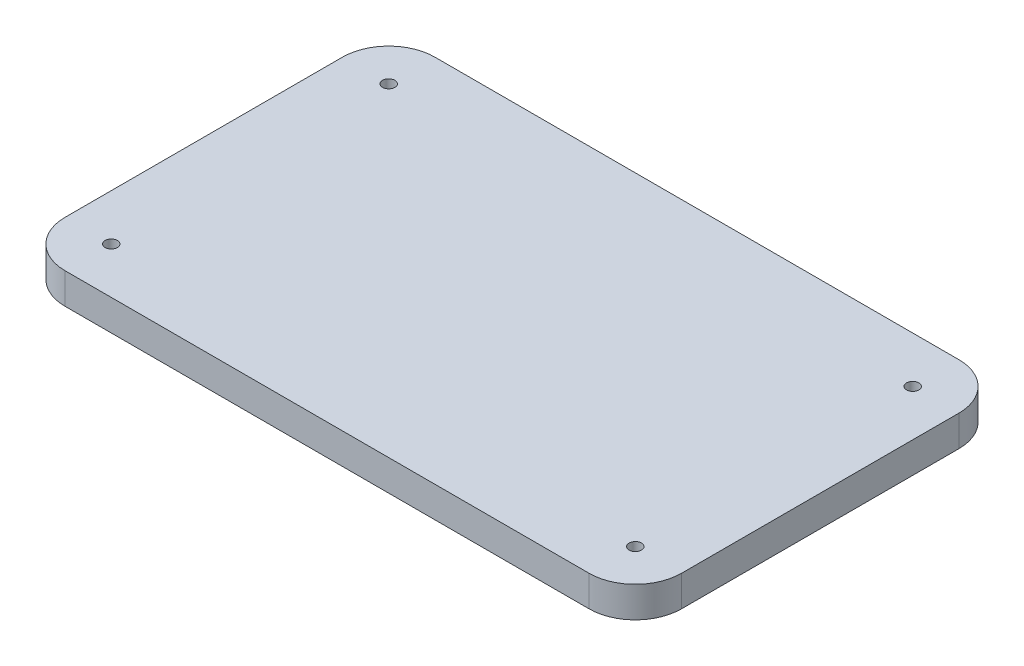
ISO-10303-21;
HEADER;
FILE_DESCRIPTION(('STEP AP214'),'2;1');
FILE_NAME('part.step','',(''),(''),'','','');
FILE_SCHEMA(('AUTOMOTIVE_DESIGN { 1 0 10303 214 1 1 1 1 }'));
ENDSEC;
DATA;
#1=APPLICATION_CONTEXT('core data for automotive mechanical design processes');
#2=APPLICATION_PROTOCOL_DEFINITION('international standard','automotive_design',2000,#1);
#3=PRODUCT_CONTEXT('',#1,'mechanical');
#4=PRODUCT('Part','Part','',(#3));
#5=PRODUCT_RELATED_PRODUCT_CATEGORY('part','',(#4));
#6=PRODUCT_DEFINITION_FORMATION('','',#4);
#7=PRODUCT_DEFINITION_CONTEXT('part definition',#1,'design');
#8=PRODUCT_DEFINITION('design','',#6,#7);
#9=PRODUCT_DEFINITION_SHAPE('','',#8);
#10=(LENGTH_UNIT() NAMED_UNIT(*) SI_UNIT(.MILLI.,.METRE.));
#11=(NAMED_UNIT(*) PLANE_ANGLE_UNIT() SI_UNIT($,.RADIAN.));
#12=(NAMED_UNIT(*) SI_UNIT($,.STERADIAN.) SOLID_ANGLE_UNIT());
#13=UNCERTAINTY_MEASURE_WITH_UNIT(LENGTH_MEASURE(1.E-05),#10,'distance_accuracy_value','');
#14=(GEOMETRIC_REPRESENTATION_CONTEXT(3) GLOBAL_UNCERTAINTY_ASSIGNED_CONTEXT((#13)) GLOBAL_UNIT_ASSIGNED_CONTEXT((#10,
#11,#12)) REPRESENTATION_CONTEXT('',''));
#15=CARTESIAN_POINT('',(0.,0.,0.));
#16=DIRECTION('',(0.,0.,1.));
#17=DIRECTION('',(1.,0.,0.));
#18=AXIS2_PLACEMENT_3D('',#15,#16,#17);
#19=CARTESIAN_POINT('',(53.975,6.35,-28.575));
#20=DIRECTION('',(0.,-1.,0.));
#21=DIRECTION('',(0.,0.,-1.));
#22=AXIS2_PLACEMENT_3D('',#19,#20,#21);
#23=CYLINDRICAL_SURFACE('',#22,9.52500000000001);
#24=CARTESIAN_POINT('',(53.975,0.,-28.575));
#25=DIRECTION('',(0.,1.,0.));
#26=DIRECTION('',(0.,0.,1.));
#27=AXIS2_PLACEMENT_3D('',#24,#25,#26);
#28=CIRCLE('',#27,9.52500000000001);
#29=CARTESIAN_POINT('',(63.5,0.,-28.575));
#30=VERTEX_POINT('',#29);
#31=CARTESIAN_POINT('',(53.975,0.,-38.1));
#32=VERTEX_POINT('',#31);
#33=EDGE_CURVE('E132',#30,#32,#28,.T.);
#34=ORIENTED_EDGE('',*,*,#33,.T.);
#35=DIRECTION('',(0.,-1.,0.));
#36=VECTOR('',#35,1.);
#37=CARTESIAN_POINT('',(53.975,6.35,-38.1));
#38=LINE('',#37,#36);
#39=CARTESIAN_POINT('',(53.975,6.35,-38.1));
#40=VERTEX_POINT('',#39);
#41=EDGE_CURVE('E11',#40,#32,#38,.T.);
#42=ORIENTED_EDGE('',*,*,#41,.F.);
#43=CARTESIAN_POINT('',(53.975,6.35,-28.575));
#44=DIRECTION('',(0.,1.,0.));
#45=DIRECTION('',(0.,0.,1.));
#46=AXIS2_PLACEMENT_3D('',#43,#44,#45);
#47=CIRCLE('',#46,9.52500000000001);
#48=CARTESIAN_POINT('',(63.5,6.35,-28.575));
#49=VERTEX_POINT('',#48);
#50=EDGE_CURVE('E147',#49,#40,#47,.T.);
#51=ORIENTED_EDGE('',*,*,#50,.F.);
#52=DIRECTION('',(0.,-1.,0.));
#53=VECTOR('',#52,1.);
#54=CARTESIAN_POINT('',(63.5,6.35,-28.575));
#55=LINE('',#54,#53);
#56=EDGE_CURVE('E128',#49,#30,#55,.T.);
#57=ORIENTED_EDGE('',*,*,#56,.T.);
#58=EDGE_LOOP('',(#34,#42,#51,#57));
#59=FACE_BOUND('',#58,.T.);
#60=ADVANCED_FACE('F35',(#59),#23,.T.);
#61=CARTESIAN_POINT('',(53.975,6.35,-38.1));
#62=DIRECTION('',(0.,0.,1.));
#63=DIRECTION('',(1.,0.,0.));
#64=AXIS2_PLACEMENT_3D('',#61,#62,#63);
#65=PLANE('',#64);
#66=DIRECTION('',(-1.,0.,0.));
#67=VECTOR('',#66,1.);
#68=CARTESIAN_POINT('',(53.975,0.,-38.1));
#69=LINE('',#68,#67);
#70=CARTESIAN_POINT('',(-53.975,0.,-38.1));
#71=VERTEX_POINT('',#70);
#72=EDGE_CURVE('E135',#32,#71,#69,.T.);
#73=ORIENTED_EDGE('',*,*,#72,.T.);
#74=DIRECTION('',(0.,-1.,0.));
#75=VECTOR('',#74,1.);
#76=CARTESIAN_POINT('',(-53.975,6.35,-38.1));
#77=LINE('',#76,#75);
#78=CARTESIAN_POINT('',(-53.975,6.35,-38.1));
#79=VERTEX_POINT('',#78);
#80=EDGE_CURVE('E44',#79,#71,#77,.T.);
#81=ORIENTED_EDGE('',*,*,#80,.F.);
#82=DIRECTION('',(-1.,0.,0.));
#83=VECTOR('',#82,1.);
#84=CARTESIAN_POINT('',(53.975,6.35,-38.1));
#85=LINE('',#84,#83);
#86=EDGE_CURVE('E95',#40,#79,#85,.T.);
#87=ORIENTED_EDGE('',*,*,#86,.F.);
#88=ORIENTED_EDGE('',*,*,#41,.T.);
#89=EDGE_LOOP('',(#73,#81,#87,#88));
#90=FACE_BOUND('',#89,.T.);
#91=ADVANCED_FACE('F230',(#90),#65,.F.);
#92=CARTESIAN_POINT('',(-53.975,6.35,-28.575));
#93=DIRECTION('',(0.,-1.,0.));
#94=DIRECTION('',(0.,0.,-1.));
#95=AXIS2_PLACEMENT_3D('',#92,#93,#94);
#96=CYLINDRICAL_SURFACE('',#95,9.525);
#97=CARTESIAN_POINT('',(-53.975,0.,-28.575));
#98=DIRECTION('',(0.,1.,0.));
#99=DIRECTION('',(0.,0.,1.));
#100=AXIS2_PLACEMENT_3D('',#97,#98,#99);
#101=CIRCLE('',#100,9.525);
#102=CARTESIAN_POINT('',(-63.5,0.,-28.575));
#103=VERTEX_POINT('',#102);
#104=EDGE_CURVE('E138',#71,#103,#101,.T.);
#105=ORIENTED_EDGE('',*,*,#104,.T.);
#106=DIRECTION('',(0.,-1.,0.));
#107=VECTOR('',#106,1.);
#108=CARTESIAN_POINT('',(-63.5,6.35,-28.575));
#109=LINE('',#108,#107);
#110=CARTESIAN_POINT('',(-63.5,6.35,-28.575));
#111=VERTEX_POINT('',#110);
#112=EDGE_CURVE('E154',#111,#103,#109,.T.);
#113=ORIENTED_EDGE('',*,*,#112,.F.);
#114=CARTESIAN_POINT('',(-53.975,6.35,-28.575));
#115=DIRECTION('',(0.,1.,0.));
#116=DIRECTION('',(0.,0.,1.));
#117=AXIS2_PLACEMENT_3D('',#114,#115,#116);
#118=CIRCLE('',#117,9.525);
#119=EDGE_CURVE('E163',#79,#111,#118,.T.);
#120=ORIENTED_EDGE('',*,*,#119,.F.);
#121=ORIENTED_EDGE('',*,*,#80,.T.);
#122=EDGE_LOOP('',(#105,#113,#120,#121));
#123=FACE_BOUND('',#122,.T.);
#124=ADVANCED_FACE('F161',(#123),#96,.T.);
#125=CARTESIAN_POINT('',(-63.5,6.35,-28.575));
#126=DIRECTION('',(1.,0.,0.));
#127=DIRECTION('',(0.,0.,-1.));
#128=AXIS2_PLACEMENT_3D('',#125,#126,#127);
#129=PLANE('',#128);
#130=DIRECTION('',(0.,0.,1.));
#131=VECTOR('',#130,1.);
#132=CARTESIAN_POINT('',(-63.5,0.,-28.575));
#133=LINE('',#132,#131);
#134=CARTESIAN_POINT('',(-63.5,0.,28.575));
#135=VERTEX_POINT('',#134);
#136=EDGE_CURVE('E140',#103,#135,#133,.T.);
#137=ORIENTED_EDGE('',*,*,#136,.T.);
#138=DIRECTION('',(0.,-1.,0.));
#139=VECTOR('',#138,1.);
#140=CARTESIAN_POINT('',(-63.5,6.35,28.575));
#141=LINE('',#140,#139);
#142=CARTESIAN_POINT('',(-63.5,6.35,28.575));
#143=VERTEX_POINT('',#142);
#144=EDGE_CURVE('E151',#143,#135,#141,.T.);
#145=ORIENTED_EDGE('',*,*,#144,.F.);
#146=DIRECTION('',(0.,0.,1.));
#147=VECTOR('',#146,1.);
#148=CARTESIAN_POINT('',(-63.5,6.35,-28.575));
#149=LINE('',#148,#147);
#150=EDGE_CURVE('E175',#111,#143,#149,.T.);
#151=ORIENTED_EDGE('',*,*,#150,.F.);
#152=ORIENTED_EDGE('',*,*,#112,.T.);
#153=EDGE_LOOP('',(#137,#145,#151,#152));
#154=FACE_BOUND('',#153,.T.);
#155=ADVANCED_FACE('F171',(#154),#129,.F.);
#156=CARTESIAN_POINT('',(-53.975,6.35,28.575));
#157=DIRECTION('',(0.,-1.,0.));
#158=DIRECTION('',(0.,0.,-1.));
#159=AXIS2_PLACEMENT_3D('',#156,#157,#158);
#160=CYLINDRICAL_SURFACE('',#159,9.525);
#161=CARTESIAN_POINT('',(-53.975,0.,28.575));
#162=DIRECTION('',(0.,1.,0.));
#163=DIRECTION('',(0.,0.,1.));
#164=AXIS2_PLACEMENT_3D('',#161,#162,#163);
#165=CIRCLE('',#164,9.525);
#166=CARTESIAN_POINT('',(-53.975,0.,38.1));
#167=VERTEX_POINT('',#166);
#168=EDGE_CURVE('E142',#135,#167,#165,.T.);
#169=ORIENTED_EDGE('',*,*,#168,.T.);
#170=DIRECTION('',(0.,-1.,0.));
#171=VECTOR('',#170,1.);
#172=CARTESIAN_POINT('',(-53.975,6.35,38.1));
#173=LINE('',#172,#171);
#174=CARTESIAN_POINT('',(-53.975,6.35,38.1));
#175=VERTEX_POINT('',#174);
#176=EDGE_CURVE('E123',#175,#167,#173,.T.);
#177=ORIENTED_EDGE('',*,*,#176,.F.);
#178=CARTESIAN_POINT('',(-53.975,6.35,28.575));
#179=DIRECTION('',(0.,1.,0.));
#180=DIRECTION('',(0.,0.,1.));
#181=AXIS2_PLACEMENT_3D('',#178,#179,#180);
#182=CIRCLE('',#181,9.525);
#183=EDGE_CURVE('E114',#143,#175,#182,.T.);
#184=ORIENTED_EDGE('',*,*,#183,.F.);
#185=ORIENTED_EDGE('',*,*,#144,.T.);
#186=EDGE_LOOP('',(#169,#177,#184,#185));
#187=FACE_BOUND('',#186,.T.);
#188=ADVANCED_FACE('F174',(#187),#160,.T.);
#189=CARTESIAN_POINT('',(-53.975,6.35,38.1));
#190=DIRECTION('',(0.,0.,-1.));
#191=DIRECTION('',(-1.,0.,0.));
#192=AXIS2_PLACEMENT_3D('',#189,#190,#191);
#193=PLANE('',#192);
#194=DIRECTION('',(1.,0.,0.));
#195=VECTOR('',#194,1.);
#196=CARTESIAN_POINT('',(-53.975,0.,38.1));
#197=LINE('',#196,#195);
#198=CARTESIAN_POINT('',(53.975,0.,38.1));
#199=VERTEX_POINT('',#198);
#200=EDGE_CURVE('E122',#167,#199,#197,.T.);
#201=ORIENTED_EDGE('',*,*,#200,.T.);
#202=DIRECTION('',(0.,-1.,0.));
#203=VECTOR('',#202,1.);
#204=CARTESIAN_POINT('',(53.975,6.35,38.1));
#205=LINE('',#204,#203);
#206=CARTESIAN_POINT('',(53.975,6.35,38.1));
#207=VERTEX_POINT('',#206);
#208=EDGE_CURVE('E119',#207,#199,#205,.T.);
#209=ORIENTED_EDGE('',*,*,#208,.F.);
#210=DIRECTION('',(1.,0.,0.));
#211=VECTOR('',#210,1.);
#212=CARTESIAN_POINT('',(-53.975,6.35,38.1));
#213=LINE('',#212,#211);
#214=EDGE_CURVE('E108',#175,#207,#213,.T.);
#215=ORIENTED_EDGE('',*,*,#214,.F.);
#216=ORIENTED_EDGE('',*,*,#176,.T.);
#217=EDGE_LOOP('',(#201,#209,#215,#216));
#218=FACE_BOUND('',#217,.T.);
#219=ADVANCED_FACE('F120',(#218),#193,.F.);
#220=CARTESIAN_POINT('',(53.975,6.35,28.575));
#221=DIRECTION('',(0.,-1.,0.));
#222=DIRECTION('',(0.,0.,-1.));
#223=AXIS2_PLACEMENT_3D('',#220,#221,#222);
#224=CYLINDRICAL_SURFACE('',#223,9.525);
#225=CARTESIAN_POINT('',(53.975,0.,28.575));
#226=DIRECTION('',(0.,1.,0.));
#227=DIRECTION('',(0.,0.,1.));
#228=AXIS2_PLACEMENT_3D('',#225,#226,#227);
#229=CIRCLE('',#228,9.525);
#230=CARTESIAN_POINT('',(63.5,0.,28.575));
#231=VERTEX_POINT('',#230);
#232=EDGE_CURVE('E81',#199,#231,#229,.T.);
#233=ORIENTED_EDGE('',*,*,#232,.T.);
#234=DIRECTION('',(0.,-1.,0.));
#235=VECTOR('',#234,1.);
#236=CARTESIAN_POINT('',(63.5,6.35,28.575));
#237=LINE('',#236,#235);
#238=CARTESIAN_POINT('',(63.5,6.35,28.575));
#239=VERTEX_POINT('',#238);
#240=EDGE_CURVE('E124',#239,#231,#237,.T.);
#241=ORIENTED_EDGE('',*,*,#240,.F.);
#242=CARTESIAN_POINT('',(53.975,6.35,28.575));
#243=DIRECTION('',(0.,1.,0.));
#244=DIRECTION('',(0.,0.,1.));
#245=AXIS2_PLACEMENT_3D('',#242,#243,#244);
#246=CIRCLE('',#245,9.525);
#247=EDGE_CURVE('E112',#207,#239,#246,.T.);
#248=ORIENTED_EDGE('',*,*,#247,.F.);
#249=ORIENTED_EDGE('',*,*,#208,.T.);
#250=EDGE_LOOP('',(#233,#241,#248,#249));
#251=FACE_BOUND('',#250,.T.);
#252=ADVANCED_FACE('F126',(#251),#224,.T.);
#253=CARTESIAN_POINT('',(63.5,6.35,28.575));
#254=DIRECTION('',(-1.,0.,0.));
#255=DIRECTION('',(0.,0.,1.));
#256=AXIS2_PLACEMENT_3D('',#253,#254,#255);
#257=PLANE('',#256);
#258=DIRECTION('',(0.,0.,-1.));
#259=VECTOR('',#258,1.);
#260=CARTESIAN_POINT('',(63.5,0.,28.575));
#261=LINE('',#260,#259);
#262=EDGE_CURVE('E87',#231,#30,#261,.T.);
#263=ORIENTED_EDGE('',*,*,#262,.T.);
#264=ORIENTED_EDGE('',*,*,#56,.F.);
#265=DIRECTION('',(0.,0.,-1.));
#266=VECTOR('',#265,1.);
#267=CARTESIAN_POINT('',(63.5,6.35,28.575));
#268=LINE('',#267,#266);
#269=EDGE_CURVE('E52',#239,#49,#268,.T.);
#270=ORIENTED_EDGE('',*,*,#269,.F.);
#271=ORIENTED_EDGE('',*,*,#240,.T.);
#272=EDGE_LOOP('',(#263,#264,#270,#271));
#273=FACE_BOUND('',#272,.T.);
#274=ADVANCED_FACE('F207',(#273),#257,.F.);
#275=CARTESIAN_POINT('',(53.975,6.35,-28.575));
#276=DIRECTION('',(0.,1.,0.));
#277=DIRECTION('',(0.,0.,1.));
#278=AXIS2_PLACEMENT_3D('',#275,#276,#277);
#279=PLANE('',#278);
#280=CARTESIAN_POINT('',(53.975,6.35,-28.575));
#281=DIRECTION('',(0.,1.,0.));
#282=DIRECTION('',(0.,0.,1.));
#283=AXIS2_PLACEMENT_3D('',#280,#281,#282);
#284=CIRCLE('',#283,1.26999999999999);
#285=CARTESIAN_POINT('',(53.975,6.35,-27.305));
#286=VERTEX_POINT('',#285);
#287=EDGE_CURVE('E198',#286,#286,#284,.T.);
#288=ORIENTED_EDGE('',*,*,#287,.F.);
#289=EDGE_LOOP('',(#288));
#290=FACE_BOUND('',#289,.T.);
#291=CARTESIAN_POINT('',(53.975,6.35,28.575));
#292=DIRECTION('',(0.,1.,0.));
#293=DIRECTION('',(0.,0.,1.));
#294=AXIS2_PLACEMENT_3D('',#291,#292,#293);
#295=CIRCLE('',#294,1.26999999999999);
#296=CARTESIAN_POINT('',(53.975,6.35,29.845));
#297=VERTEX_POINT('',#296);
#298=EDGE_CURVE('E192',#297,#297,#295,.T.);
#299=ORIENTED_EDGE('',*,*,#298,.F.);
#300=EDGE_LOOP('',(#299));
#301=FACE_BOUND('',#300,.T.);
#302=CARTESIAN_POINT('',(-53.975,6.35,-28.575));
#303=DIRECTION('',(0.,1.,0.));
#304=DIRECTION('',(0.,0.,1.));
#305=AXIS2_PLACEMENT_3D('',#302,#303,#304);
#306=CIRCLE('',#305,1.26999999999999);
#307=CARTESIAN_POINT('',(-53.975,6.35,-27.305));
#308=VERTEX_POINT('',#307);
#309=EDGE_CURVE('E189',#308,#308,#306,.T.);
#310=ORIENTED_EDGE('',*,*,#309,.F.);
#311=EDGE_LOOP('',(#310));
#312=FACE_BOUND('',#311,.T.);
#313=CARTESIAN_POINT('',(-53.975,6.35,28.575));
#314=DIRECTION('',(0.,1.,0.));
#315=DIRECTION('',(0.,0.,1.));
#316=AXIS2_PLACEMENT_3D('',#313,#314,#315);
#317=CIRCLE('',#316,1.26999999999999);
#318=CARTESIAN_POINT('',(-53.975,6.35,29.845));
#319=VERTEX_POINT('',#318);
#320=EDGE_CURVE('E183',#319,#319,#317,.T.);
#321=ORIENTED_EDGE('',*,*,#320,.F.);
#322=EDGE_LOOP('',(#321));
#323=FACE_BOUND('',#322,.T.);
#324=ORIENTED_EDGE('',*,*,#50,.T.);
#325=ORIENTED_EDGE('',*,*,#86,.T.);
#326=ORIENTED_EDGE('',*,*,#119,.T.);
#327=ORIENTED_EDGE('',*,*,#150,.T.);
#328=ORIENTED_EDGE('',*,*,#183,.T.);
#329=ORIENTED_EDGE('',*,*,#214,.T.);
#330=ORIENTED_EDGE('',*,*,#247,.T.);
#331=ORIENTED_EDGE('',*,*,#269,.T.);
#332=EDGE_LOOP('',(#324,#325,#326,#327,#328,#329,#330,#331));
#333=FACE_BOUND('',#332,.T.);
#334=ADVANCED_FACE('F110',(#290,#301,#312,#323,#333),#279,.T.);
#335=CARTESIAN_POINT('',(53.975,0.,-28.575));
#336=DIRECTION('',(0.,1.,0.));
#337=DIRECTION('',(0.,0.,1.));
#338=AXIS2_PLACEMENT_3D('',#335,#336,#337);
#339=PLANE('',#338);
#340=CARTESIAN_POINT('',(53.975,0.,-28.575));
#341=DIRECTION('',(0.,1.,0.));
#342=DIRECTION('',(0.,0.,1.));
#343=AXIS2_PLACEMENT_3D('',#340,#341,#342);
#344=CIRCLE('',#343,1.26999999999999);
#345=CARTESIAN_POINT('',(53.975,0.,-27.305));
#346=VERTEX_POINT('',#345);
#347=EDGE_CURVE('E195',#346,#346,#344,.T.);
#348=ORIENTED_EDGE('',*,*,#347,.T.);
#349=EDGE_LOOP('',(#348));
#350=FACE_BOUND('',#349,.T.);
#351=CARTESIAN_POINT('',(53.975,0.,28.575));
#352=DIRECTION('',(0.,1.,0.));
#353=DIRECTION('',(0.,0.,1.));
#354=AXIS2_PLACEMENT_3D('',#351,#352,#353);
#355=CIRCLE('',#354,1.26999999999999);
#356=CARTESIAN_POINT('',(53.975,0.,29.845));
#357=VERTEX_POINT('',#356);
#358=EDGE_CURVE('E38',#357,#357,#355,.T.);
#359=ORIENTED_EDGE('',*,*,#358,.T.);
#360=EDGE_LOOP('',(#359));
#361=FACE_BOUND('',#360,.T.);
#362=CARTESIAN_POINT('',(-53.975,0.,-28.575));
#363=DIRECTION('',(0.,1.,0.));
#364=DIRECTION('',(0.,0.,1.));
#365=AXIS2_PLACEMENT_3D('',#362,#363,#364);
#366=CIRCLE('',#365,1.26999999999999);
#367=CARTESIAN_POINT('',(-53.975,0.,-27.305));
#368=VERTEX_POINT('',#367);
#369=EDGE_CURVE('E186',#368,#368,#366,.T.);
#370=ORIENTED_EDGE('',*,*,#369,.T.);
#371=EDGE_LOOP('',(#370));
#372=FACE_BOUND('',#371,.T.);
#373=CARTESIAN_POINT('',(-53.975,0.,28.575));
#374=DIRECTION('',(0.,1.,0.));
#375=DIRECTION('',(0.,0.,1.));
#376=AXIS2_PLACEMENT_3D('',#373,#374,#375);
#377=CIRCLE('',#376,1.26999999999999);
#378=CARTESIAN_POINT('',(-53.975,0.,29.845));
#379=VERTEX_POINT('',#378);
#380=EDGE_CURVE('E136',#379,#379,#377,.T.);
#381=ORIENTED_EDGE('',*,*,#380,.T.);
#382=EDGE_LOOP('',(#381));
#383=FACE_BOUND('',#382,.T.);
#384=ORIENTED_EDGE('',*,*,#33,.F.);
#385=ORIENTED_EDGE('',*,*,#262,.F.);
#386=ORIENTED_EDGE('',*,*,#232,.F.);
#387=ORIENTED_EDGE('',*,*,#200,.F.);
#388=ORIENTED_EDGE('',*,*,#168,.F.);
#389=ORIENTED_EDGE('',*,*,#136,.F.);
#390=ORIENTED_EDGE('',*,*,#104,.F.);
#391=ORIENTED_EDGE('',*,*,#72,.F.);
#392=EDGE_LOOP('',(#384,#385,#386,#387,#388,#389,#390,#391));
#393=FACE_BOUND('',#392,.T.);
#394=ADVANCED_FACE('F167',(#350,#361,#372,#383,#393),#339,.F.);
#395=CARTESIAN_POINT('',(-53.975,6.35,28.575));
#396=DIRECTION('',(0.,1.,0.));
#397=DIRECTION('',(0.,0.,1.));
#398=AXIS2_PLACEMENT_3D('',#395,#396,#397);
#399=CYLINDRICAL_SURFACE('',#398,1.26999999999999);
#400=ORIENTED_EDGE('',*,*,#320,.T.);
#401=EDGE_LOOP('',(#400));
#402=FACE_BOUND('',#401,.T.);
#403=ORIENTED_EDGE('',*,*,#380,.F.);
#404=EDGE_LOOP('',(#403));
#405=FACE_BOUND('',#404,.T.);
#406=ADVANCED_FACE('F215',(#402,#405),#399,.F.);
#407=CARTESIAN_POINT('',(-53.975,6.35,-28.575));
#408=DIRECTION('',(0.,1.,0.));
#409=DIRECTION('',(0.,0.,1.));
#410=AXIS2_PLACEMENT_3D('',#407,#408,#409);
#411=CYLINDRICAL_SURFACE('',#410,1.26999999999999);
#412=ORIENTED_EDGE('',*,*,#309,.T.);
#413=EDGE_LOOP('',(#412));
#414=FACE_BOUND('',#413,.T.);
#415=ORIENTED_EDGE('',*,*,#369,.F.);
#416=EDGE_LOOP('',(#415));
#417=FACE_BOUND('',#416,.T.);
#418=ADVANCED_FACE('F218',(#414,#417),#411,.F.);
#419=CARTESIAN_POINT('',(53.975,6.35,28.575));
#420=DIRECTION('',(0.,1.,0.));
#421=DIRECTION('',(0.,0.,1.));
#422=AXIS2_PLACEMENT_3D('',#419,#420,#421);
#423=CYLINDRICAL_SURFACE('',#422,1.26999999999999);
#424=ORIENTED_EDGE('',*,*,#298,.T.);
#425=EDGE_LOOP('',(#424));
#426=FACE_BOUND('',#425,.T.);
#427=ORIENTED_EDGE('',*,*,#358,.F.);
#428=EDGE_LOOP('',(#427));
#429=FACE_BOUND('',#428,.T.);
#430=ADVANCED_FACE('F301',(#426,#429),#423,.F.);
#431=CARTESIAN_POINT('',(53.975,6.35,-28.575));
#432=DIRECTION('',(0.,1.,0.));
#433=DIRECTION('',(0.,0.,1.));
#434=AXIS2_PLACEMENT_3D('',#431,#432,#433);
#435=CYLINDRICAL_SURFACE('',#434,1.26999999999999);
#436=ORIENTED_EDGE('',*,*,#287,.T.);
#437=EDGE_LOOP('',(#436));
#438=FACE_BOUND('',#437,.T.);
#439=ORIENTED_EDGE('',*,*,#347,.F.);
#440=EDGE_LOOP('',(#439));
#441=FACE_BOUND('',#440,.T.);
#442=ADVANCED_FACE('F202',(#438,#441),#435,.F.);
#443=CLOSED_SHELL('',(#60,#91,#124,#155,#188,#219,#252,#274,#334,#394,#406,#418,#430,#442));
#444=MANIFOLD_SOLID_BREP('B2',#443);
#445=ADVANCED_BREP_SHAPE_REPRESENTATION('',(#18,#444),#14);
#446=SHAPE_DEFINITION_REPRESENTATION(#9,#445);
ENDSEC;
END-ISO-10303-21;
